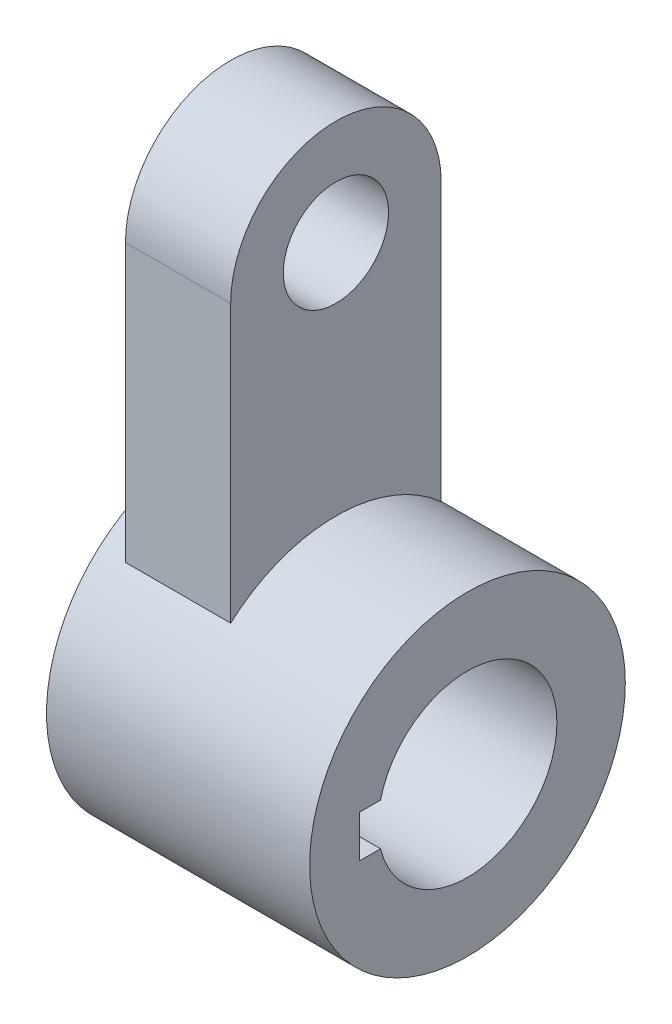
ISO-10303-21;
HEADER;
FILE_DESCRIPTION(('STEP AP214'),'2;1');
FILE_NAME('part.step','',(''),(''),'','','');
FILE_SCHEMA(('AUTOMOTIVE_DESIGN { 1 0 10303 214 1 1 1 1 }'));
ENDSEC;
DATA;
#1=APPLICATION_CONTEXT('core data for automotive mechanical design processes');
#2=APPLICATION_PROTOCOL_DEFINITION('international standard','automotive_design',2000,#1);
#3=PRODUCT_CONTEXT('',#1,'mechanical');
#4=PRODUCT('Part','Part','',(#3));
#5=PRODUCT_RELATED_PRODUCT_CATEGORY('part','',(#4));
#6=PRODUCT_DEFINITION_FORMATION('','',#4);
#7=PRODUCT_DEFINITION_CONTEXT('part definition',#1,'design');
#8=PRODUCT_DEFINITION('design','',#6,#7);
#9=PRODUCT_DEFINITION_SHAPE('','',#8);
#10=(LENGTH_UNIT() NAMED_UNIT(*) SI_UNIT(.MILLI.,.METRE.));
#11=(NAMED_UNIT(*) PLANE_ANGLE_UNIT() SI_UNIT($,.RADIAN.));
#12=(NAMED_UNIT(*) SI_UNIT($,.STERADIAN.) SOLID_ANGLE_UNIT());
#13=UNCERTAINTY_MEASURE_WITH_UNIT(LENGTH_MEASURE(1.E-05),#10,'distance_accuracy_value','');
#14=(GEOMETRIC_REPRESENTATION_CONTEXT(3) GLOBAL_UNCERTAINTY_ASSIGNED_CONTEXT((#13)) GLOBAL_UNIT_ASSIGNED_CONTEXT((#10,
#11,#12)) REPRESENTATION_CONTEXT('',''));
#15=CARTESIAN_POINT('',(0.,0.,0.));
#16=DIRECTION('',(0.,0.,1.));
#17=DIRECTION('',(1.,0.,0.));
#18=AXIS2_PLACEMENT_3D('',#15,#16,#17);
#19=CARTESIAN_POINT('',(25.,0.,0.));
#20=DIRECTION('',(-1.,0.,0.));
#21=DIRECTION('',(0.,0.,1.));
#22=AXIS2_PLACEMENT_3D('',#19,#20,#21);
#23=CYLINDRICAL_SURFACE('',#22,30.);
#24=CARTESIAN_POINT('',(-25.,0.,0.));
#25=DIRECTION('',(1.,0.,0.));
#26=DIRECTION('',(0.,0.,-1.));
#27=AXIS2_PLACEMENT_3D('',#24,#25,#26);
#28=CIRCLE('',#27,30.);
#29=CARTESIAN_POINT('',(-25.,0.,-30.));
#30=VERTEX_POINT('',#29);
#31=EDGE_CURVE('E42',#30,#30,#28,.T.);
#32=ORIENTED_EDGE('',*,*,#31,.T.);
#33=EDGE_LOOP('',(#32));
#34=FACE_BOUND('',#33,.T.);
#35=CARTESIAN_POINT('',(25.,0.,0.));
#36=DIRECTION('',(1.,0.,0.));
#37=DIRECTION('',(0.,0.,-1.));
#38=AXIS2_PLACEMENT_3D('',#35,#36,#37);
#39=CIRCLE('',#38,30.);
#40=CARTESIAN_POINT('',(25.,0.,-30.));
#41=VERTEX_POINT('',#40);
#42=EDGE_CURVE('E11',#41,#41,#39,.T.);
#43=ORIENTED_EDGE('',*,*,#42,.F.);
#44=EDGE_LOOP('',(#43));
#45=FACE_BOUND('',#44,.T.);
#46=CARTESIAN_POINT('',(-20.,0.,0.));
#47=DIRECTION('',(1.,0.,0.));
#48=DIRECTION('',(0.,0.,-1.));
#49=AXIS2_PLACEMENT_3D('',#46,#47,#48);
#50=CIRCLE('',#49,30.);
#51=CARTESIAN_POINT('',(-20.,22.3606797749979,-20.));
#52=VERTEX_POINT('',#51);
#53=CARTESIAN_POINT('',(-20.,22.3606797749979,20.));
#54=VERTEX_POINT('',#53);
#55=EDGE_CURVE('E152',#52,#54,#50,.T.);
#56=ORIENTED_EDGE('',*,*,#55,.F.);
#57=DIRECTION('',(1.,0.,0.));
#58=VECTOR('',#57,1.);
#59=CARTESIAN_POINT('',(-20.,22.3606797749979,-20.));
#60=LINE('',#59,#58);
#61=CARTESIAN_POINT('',(0.,22.3606797749979,-20.));
#62=VERTEX_POINT('',#61);
#63=EDGE_CURVE('E167',#52,#62,#60,.T.);
#64=ORIENTED_EDGE('',*,*,#63,.T.);
#65=CARTESIAN_POINT('',(0.,0.,0.));
#66=DIRECTION('',(1.,0.,0.));
#67=DIRECTION('',(0.,0.,-1.));
#68=AXIS2_PLACEMENT_3D('',#65,#66,#67);
#69=CIRCLE('',#68,30.);
#70=CARTESIAN_POINT('',(0.,22.3606797749979,20.));
#71=VERTEX_POINT('',#70);
#72=EDGE_CURVE('E144',#62,#71,#69,.T.);
#73=ORIENTED_EDGE('',*,*,#72,.T.);
#74=DIRECTION('',(1.,0.,0.));
#75=VECTOR('',#74,1.);
#76=CARTESIAN_POINT('',(-20.,22.3606797749979,20.));
#77=LINE('',#76,#75);
#78=EDGE_CURVE('E170',#54,#71,#77,.T.);
#79=ORIENTED_EDGE('',*,*,#78,.F.);
#80=EDGE_LOOP('',(#56,#64,#73,#79));
#81=FACE_BOUND('',#80,.T.);
#82=ADVANCED_FACE('F39',(#34,#45,#81),#23,.T.);
#83=CARTESIAN_POINT('',(25.,0.,0.));
#84=DIRECTION('',(1.,0.,0.));
#85=DIRECTION('',(0.,0.,-1.));
#86=AXIS2_PLACEMENT_3D('',#83,#84,#85);
#87=PLANE('',#86);
#88=DIRECTION('',(0.,0.,-1.));
#89=VECTOR('',#88,1.);
#90=CARTESIAN_POINT('',(25.,-4.,20.5227116418583));
#91=LINE('',#90,#89);
#92=CARTESIAN_POINT('',(25.,-4.,20.5227116418583));
#93=VERTEX_POINT('',#92);
#94=CARTESIAN_POINT('',(25.,-3.99999999999999,16.5227116418583));
#95=VERTEX_POINT('',#94);
#96=EDGE_CURVE('E53',#93,#95,#91,.T.);
#97=ORIENTED_EDGE('',*,*,#96,.F.);
#98=DIRECTION('',(0.,-1.,0.));
#99=VECTOR('',#98,1.);
#100=CARTESIAN_POINT('',(25.,-4.,20.5227116418583));
#101=LINE('',#100,#99);
#102=CARTESIAN_POINT('',(25.,4.,20.5227116418583));
#103=VERTEX_POINT('',#102);
#104=EDGE_CURVE('E121',#103,#93,#101,.T.);
#105=ORIENTED_EDGE('',*,*,#104,.F.);
#106=DIRECTION('',(0.,0.,1.));
#107=VECTOR('',#106,1.);
#108=CARTESIAN_POINT('',(25.,4.,20.5227116418583));
#109=LINE('',#108,#107);
#110=CARTESIAN_POINT('',(25.,4.,16.5227116418583));
#111=VERTEX_POINT('',#110);
#112=EDGE_CURVE('E124',#111,#103,#109,.T.);
#113=ORIENTED_EDGE('',*,*,#112,.F.);
#114=CARTESIAN_POINT('',(25.,0.,0.));
#115=DIRECTION('',(1.,0.,0.));
#116=DIRECTION('',(0.,0.,-1.));
#117=AXIS2_PLACEMENT_3D('',#114,#115,#116);
#118=CIRCLE('',#117,17.);
#119=EDGE_CURVE('E130',#95,#111,#118,.T.);
#120=ORIENTED_EDGE('',*,*,#119,.F.);
#121=EDGE_LOOP('',(#97,#105,#113,#120));
#122=FACE_BOUND('',#121,.T.);
#123=ORIENTED_EDGE('',*,*,#42,.T.);
#124=EDGE_LOOP('',(#123));
#125=FACE_BOUND('',#124,.T.);
#126=ADVANCED_FACE('F208',(#122,#125),#87,.T.);
#127=CARTESIAN_POINT('',(-25.,0.,0.));
#128=DIRECTION('',(1.,0.,0.));
#129=DIRECTION('',(0.,0.,-1.));
#130=AXIS2_PLACEMENT_3D('',#127,#128,#129);
#131=PLANE('',#130);
#132=DIRECTION('',(0.,-1.,0.));
#133=VECTOR('',#132,1.);
#134=CARTESIAN_POINT('',(-25.,-4.,20.5227116418583));
#135=LINE('',#134,#133);
#136=CARTESIAN_POINT('',(-25.,4.,20.5227116418583));
#137=VERTEX_POINT('',#136);
#138=CARTESIAN_POINT('',(-25.,-4.,20.5227116418583));
#139=VERTEX_POINT('',#138);
#140=EDGE_CURVE('E111',#137,#139,#135,.T.);
#141=ORIENTED_EDGE('',*,*,#140,.T.);
#142=DIRECTION('',(0.,0.,-1.));
#143=VECTOR('',#142,1.);
#144=CARTESIAN_POINT('',(-25.,-4.,20.5227116418583));
#145=LINE('',#144,#143);
#146=CARTESIAN_POINT('',(-25.,-3.99999999999999,16.5227116418583));
#147=VERTEX_POINT('',#146);
#148=EDGE_CURVE('E105',#139,#147,#145,.T.);
#149=ORIENTED_EDGE('',*,*,#148,.T.);
#150=CARTESIAN_POINT('',(-25.,0.,0.));
#151=DIRECTION('',(1.,0.,0.));
#152=DIRECTION('',(0.,0.,-1.));
#153=AXIS2_PLACEMENT_3D('',#150,#151,#152);
#154=CIRCLE('',#153,17.);
#155=CARTESIAN_POINT('',(-25.,4.,16.5227116418583));
#156=VERTEX_POINT('',#155);
#157=EDGE_CURVE('E114',#147,#156,#154,.T.);
#158=ORIENTED_EDGE('',*,*,#157,.T.);
#159=DIRECTION('',(0.,0.,1.));
#160=VECTOR('',#159,1.);
#161=CARTESIAN_POINT('',(-25.,4.,20.5227116418583));
#162=LINE('',#161,#160);
#163=EDGE_CURVE('E61',#156,#137,#162,.T.);
#164=ORIENTED_EDGE('',*,*,#163,.T.);
#165=EDGE_LOOP('',(#141,#149,#158,#164));
#166=FACE_BOUND('',#165,.T.);
#167=ORIENTED_EDGE('',*,*,#31,.F.);
#168=EDGE_LOOP('',(#167));
#169=FACE_BOUND('',#168,.T.);
#170=ADVANCED_FACE('F118',(#166,#169),#131,.F.);
#171=CARTESIAN_POINT('',(-20.,0.,-20.));
#172=DIRECTION('',(0.,0.,1.));
#173=DIRECTION('',(1.,0.,0.));
#174=AXIS2_PLACEMENT_3D('',#171,#172,#173);
#175=PLANE('',#174);
#176=DIRECTION('',(0.,-1.,0.));
#177=VECTOR('',#176,1.);
#178=CARTESIAN_POINT('',(0.,0.,-20.));
#179=LINE('',#178,#177);
#180=CARTESIAN_POINT('',(0.,75.,-20.));
#181=VERTEX_POINT('',#180);
#182=EDGE_CURVE('E157',#181,#62,#179,.T.);
#183=ORIENTED_EDGE('',*,*,#182,.T.);
#184=ORIENTED_EDGE('',*,*,#63,.F.);
#185=DIRECTION('',(0.,-1.,0.));
#186=VECTOR('',#185,1.);
#187=CARTESIAN_POINT('',(-20.,0.,-20.));
#188=LINE('',#187,#186);
#189=CARTESIAN_POINT('',(-20.,75.,-20.));
#190=VERTEX_POINT('',#189);
#191=EDGE_CURVE('E143',#190,#52,#188,.T.);
#192=ORIENTED_EDGE('',*,*,#191,.F.);
#193=DIRECTION('',(1.,0.,0.));
#194=VECTOR('',#193,1.);
#195=CARTESIAN_POINT('',(-20.,75.,-20.));
#196=LINE('',#195,#194);
#197=EDGE_CURVE('E154',#190,#181,#196,.T.);
#198=ORIENTED_EDGE('',*,*,#197,.T.);
#199=EDGE_LOOP('',(#183,#184,#192,#198));
#200=FACE_BOUND('',#199,.T.);
#201=ADVANCED_FACE('F178',(#200),#175,.F.);
#202=CARTESIAN_POINT('',(-20.,0.,20.));
#203=DIRECTION('',(0.,0.,1.));
#204=DIRECTION('',(1.,0.,0.));
#205=AXIS2_PLACEMENT_3D('',#202,#203,#204);
#206=PLANE('',#205);
#207=DIRECTION('',(0.,-1.,0.));
#208=VECTOR('',#207,1.);
#209=CARTESIAN_POINT('',(0.,0.,20.));
#210=LINE('',#209,#208);
#211=CARTESIAN_POINT('',(0.,75.,20.));
#212=VERTEX_POINT('',#211);
#213=EDGE_CURVE('E163',#212,#71,#210,.T.);
#214=ORIENTED_EDGE('',*,*,#213,.F.);
#215=DIRECTION('',(1.,0.,0.));
#216=VECTOR('',#215,1.);
#217=CARTESIAN_POINT('',(-20.,75.,20.));
#218=LINE('',#217,#216);
#219=CARTESIAN_POINT('',(-20.,75.,20.));
#220=VERTEX_POINT('',#219);
#221=EDGE_CURVE('E173',#220,#212,#218,.T.);
#222=ORIENTED_EDGE('',*,*,#221,.F.);
#223=DIRECTION('',(0.,-1.,0.));
#224=VECTOR('',#223,1.);
#225=CARTESIAN_POINT('',(-20.,0.,20.));
#226=LINE('',#225,#224);
#227=EDGE_CURVE('E149',#220,#54,#226,.T.);
#228=ORIENTED_EDGE('',*,*,#227,.T.);
#229=ORIENTED_EDGE('',*,*,#78,.T.);
#230=EDGE_LOOP('',(#214,#222,#228,#229));
#231=FACE_BOUND('',#230,.T.);
#232=ADVANCED_FACE('F189',(#231),#206,.T.);
#233=CARTESIAN_POINT('',(-20.,75.,0.));
#234=DIRECTION('',(1.,0.,0.));
#235=DIRECTION('',(0.,0.,-1.));
#236=AXIS2_PLACEMENT_3D('',#233,#234,#235);
#237=CYLINDRICAL_SURFACE('',#236,9.99999999999999);
#238=CARTESIAN_POINT('',(-20.,75.,0.));
#239=DIRECTION('',(1.,0.,0.));
#240=DIRECTION('',(0.,0.,-1.));
#241=AXIS2_PLACEMENT_3D('',#238,#239,#240);
#242=CIRCLE('',#241,9.99999999999999);
#243=CARTESIAN_POINT('',(-20.,75.,-9.99999999999999));
#244=VERTEX_POINT('',#243);
#245=EDGE_CURVE('E140',#244,#244,#242,.T.);
#246=ORIENTED_EDGE('',*,*,#245,.F.);
#247=EDGE_LOOP('',(#246));
#248=FACE_BOUND('',#247,.T.);
#249=CARTESIAN_POINT('',(0.,75.,0.));
#250=DIRECTION('',(1.,0.,0.));
#251=DIRECTION('',(0.,0.,-1.));
#252=AXIS2_PLACEMENT_3D('',#249,#250,#251);
#253=CIRCLE('',#252,9.99999999999999);
#254=CARTESIAN_POINT('',(0.,75.,-9.99999999999999));
#255=VERTEX_POINT('',#254);
#256=EDGE_CURVE('E136',#255,#255,#253,.T.);
#257=ORIENTED_EDGE('',*,*,#256,.T.);
#258=EDGE_LOOP('',(#257));
#259=FACE_BOUND('',#258,.T.);
#260=ADVANCED_FACE('F204',(#248,#259),#237,.F.);
#261=CARTESIAN_POINT('',(-20.,75.,0.));
#262=DIRECTION('',(1.,0.,0.));
#263=DIRECTION('',(0.,0.,-1.));
#264=AXIS2_PLACEMENT_3D('',#261,#262,#263);
#265=CYLINDRICAL_SURFACE('',#264,20.);
#266=CARTESIAN_POINT('',(0.,75.,0.));
#267=DIRECTION('',(1.,0.,0.));
#268=DIRECTION('',(0.,0.,-1.));
#269=AXIS2_PLACEMENT_3D('',#266,#267,#268);
#270=CIRCLE('',#269,20.);
#271=EDGE_CURVE('E160',#181,#212,#270,.T.);
#272=ORIENTED_EDGE('',*,*,#271,.F.);
#273=ORIENTED_EDGE('',*,*,#197,.F.);
#274=CARTESIAN_POINT('',(-20.,75.,0.));
#275=DIRECTION('',(1.,0.,0.));
#276=DIRECTION('',(0.,0.,-1.));
#277=AXIS2_PLACEMENT_3D('',#274,#275,#276);
#278=CIRCLE('',#277,20.);
#279=EDGE_CURVE('E146',#190,#220,#278,.T.);
#280=ORIENTED_EDGE('',*,*,#279,.T.);
#281=ORIENTED_EDGE('',*,*,#221,.T.);
#282=EDGE_LOOP('',(#272,#273,#280,#281));
#283=FACE_BOUND('',#282,.T.);
#284=ADVANCED_FACE('F185',(#283),#265,.T.);
#285=CARTESIAN_POINT('',(-20.,0.,0.));
#286=DIRECTION('',(1.,0.,0.));
#287=DIRECTION('',(0.,0.,-1.));
#288=AXIS2_PLACEMENT_3D('',#285,#286,#287);
#289=PLANE('',#288);
#290=ORIENTED_EDGE('',*,*,#245,.T.);
#291=EDGE_LOOP('',(#290));
#292=FACE_BOUND('',#291,.T.);
#293=ORIENTED_EDGE('',*,*,#191,.T.);
#294=ORIENTED_EDGE('',*,*,#55,.T.);
#295=ORIENTED_EDGE('',*,*,#227,.F.);
#296=ORIENTED_EDGE('',*,*,#279,.F.);
#297=EDGE_LOOP('',(#293,#294,#295,#296));
#298=FACE_BOUND('',#297,.T.);
#299=ADVANCED_FACE('F194',(#292,#298),#289,.F.);
#300=CARTESIAN_POINT('',(0.,0.,0.));
#301=DIRECTION('',(1.,0.,0.));
#302=DIRECTION('',(0.,0.,-1.));
#303=AXIS2_PLACEMENT_3D('',#300,#301,#302);
#304=PLANE('',#303);
#305=ORIENTED_EDGE('',*,*,#256,.F.);
#306=EDGE_LOOP('',(#305));
#307=FACE_BOUND('',#306,.T.);
#308=ORIENTED_EDGE('',*,*,#182,.F.);
#309=ORIENTED_EDGE('',*,*,#271,.T.);
#310=ORIENTED_EDGE('',*,*,#213,.T.);
#311=ORIENTED_EDGE('',*,*,#72,.F.);
#312=EDGE_LOOP('',(#308,#309,#310,#311));
#313=FACE_BOUND('',#312,.T.);
#314=ADVANCED_FACE('F184',(#307,#313),#304,.T.);
#315=CARTESIAN_POINT('',(-25.,-4.,20.5227116418583));
#316=DIRECTION('',(0.,-1.,0.));
#317=DIRECTION('',(0.,0.,-1.));
#318=AXIS2_PLACEMENT_3D('',#315,#316,#317);
#319=PLANE('',#318);
#320=ORIENTED_EDGE('',*,*,#96,.T.);
#321=DIRECTION('',(1.,0.,0.));
#322=VECTOR('',#321,1.);
#323=CARTESIAN_POINT('',(-25.,-3.99999999999999,16.5227116418583));
#324=LINE('',#323,#322);
#325=EDGE_CURVE('E101',#147,#95,#324,.T.);
#326=ORIENTED_EDGE('',*,*,#325,.F.);
#327=ORIENTED_EDGE('',*,*,#148,.F.);
#328=DIRECTION('',(1.,0.,0.));
#329=VECTOR('',#328,1.);
#330=CARTESIAN_POINT('',(-25.,-4.,20.5227116418583));
#331=LINE('',#330,#329);
#332=EDGE_CURVE('E134',#139,#93,#331,.T.);
#333=ORIENTED_EDGE('',*,*,#332,.T.);
#334=EDGE_LOOP('',(#320,#326,#327,#333));
#335=FACE_BOUND('',#334,.T.);
#336=ADVANCED_FACE('F103',(#335),#319,.F.);
#337=CARTESIAN_POINT('',(-25.,-4.,20.5227116418583));
#338=DIRECTION('',(0.,0.,1.));
#339=DIRECTION('',(1.,0.,0.));
#340=AXIS2_PLACEMENT_3D('',#337,#338,#339);
#341=PLANE('',#340);
#342=ORIENTED_EDGE('',*,*,#104,.T.);
#343=ORIENTED_EDGE('',*,*,#332,.F.);
#344=ORIENTED_EDGE('',*,*,#140,.F.);
#345=DIRECTION('',(1.,0.,0.));
#346=VECTOR('',#345,1.);
#347=CARTESIAN_POINT('',(-25.,4.,20.5227116418583));
#348=LINE('',#347,#346);
#349=EDGE_CURVE('E137',#137,#103,#348,.T.);
#350=ORIENTED_EDGE('',*,*,#349,.T.);
#351=EDGE_LOOP('',(#342,#343,#344,#350));
#352=FACE_BOUND('',#351,.T.);
#353=ADVANCED_FACE('F264',(#352),#341,.F.);
#354=CARTESIAN_POINT('',(-25.,4.,20.5227116418583));
#355=DIRECTION('',(0.,1.,0.));
#356=DIRECTION('',(0.,0.,1.));
#357=AXIS2_PLACEMENT_3D('',#354,#355,#356);
#358=PLANE('',#357);
#359=ORIENTED_EDGE('',*,*,#112,.T.);
#360=ORIENTED_EDGE('',*,*,#349,.F.);
#361=ORIENTED_EDGE('',*,*,#163,.F.);
#362=DIRECTION('',(1.,0.,0.));
#363=VECTOR('',#362,1.);
#364=CARTESIAN_POINT('',(-25.,4.,16.5227116418583));
#365=LINE('',#364,#363);
#366=EDGE_CURVE('E110',#156,#111,#365,.T.);
#367=ORIENTED_EDGE('',*,*,#366,.T.);
#368=EDGE_LOOP('',(#359,#360,#361,#367));
#369=FACE_BOUND('',#368,.T.);
#370=ADVANCED_FACE('F272',(#369),#358,.F.);
#371=CARTESIAN_POINT('',(-25.,0.,0.));
#372=DIRECTION('',(1.,0.,0.));
#373=DIRECTION('',(0.,0.,-1.));
#374=AXIS2_PLACEMENT_3D('',#371,#372,#373);
#375=CYLINDRICAL_SURFACE('',#374,17.);
#376=ORIENTED_EDGE('',*,*,#119,.T.);
#377=ORIENTED_EDGE('',*,*,#366,.F.);
#378=ORIENTED_EDGE('',*,*,#157,.F.);
#379=ORIENTED_EDGE('',*,*,#325,.T.);
#380=EDGE_LOOP('',(#376,#377,#378,#379));
#381=FACE_BOUND('',#380,.T.);
#382=ADVANCED_FACE('F115',(#381),#375,.F.);
#383=CLOSED_SHELL('',(#82,#126,#170,#201,#232,#260,#284,#299,#314,#336,#353,#370,#382));
#384=MANIFOLD_SOLID_BREP('B2',#383);
#385=ADVANCED_BREP_SHAPE_REPRESENTATION('',(#18,#384),#14);
#386=SHAPE_DEFINITION_REPRESENTATION(#9,#385);
ENDSEC;
END-ISO-10303-21;
